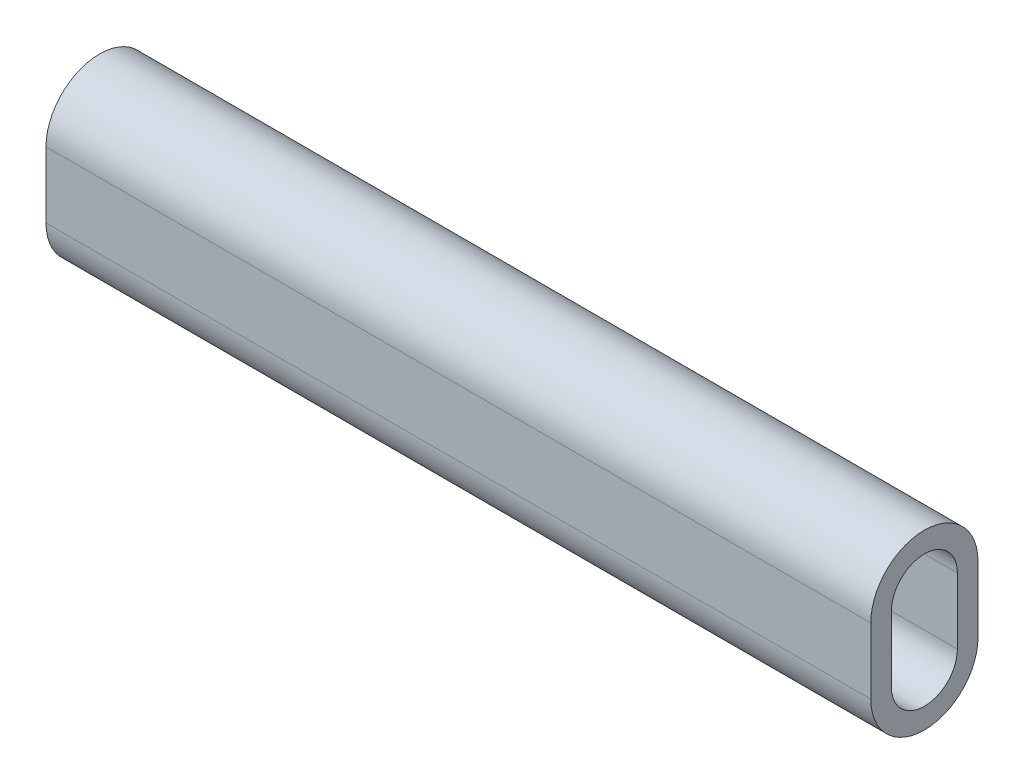
ISO-10303-21;
HEADER;
FILE_DESCRIPTION(('STEP AP214'),'2;1');
FILE_NAME('part.step','',(''),(''),'','','');
FILE_SCHEMA(('AUTOMOTIVE_DESIGN { 1 0 10303 214 1 1 1 1 }'));
ENDSEC;
DATA;
#1=APPLICATION_CONTEXT('core data for automotive mechanical design processes');
#2=APPLICATION_PROTOCOL_DEFINITION('international standard','automotive_design',2000,#1);
#3=PRODUCT_CONTEXT('',#1,'mechanical');
#4=PRODUCT('Part','Part','',(#3));
#5=PRODUCT_RELATED_PRODUCT_CATEGORY('part','',(#4));
#6=PRODUCT_DEFINITION_FORMATION('','',#4);
#7=PRODUCT_DEFINITION_CONTEXT('part definition',#1,'design');
#8=PRODUCT_DEFINITION('design','',#6,#7);
#9=PRODUCT_DEFINITION_SHAPE('','',#8);
#10=(LENGTH_UNIT() NAMED_UNIT(*) SI_UNIT(.MILLI.,.METRE.));
#11=(NAMED_UNIT(*) PLANE_ANGLE_UNIT() SI_UNIT($,.RADIAN.));
#12=(NAMED_UNIT(*) SI_UNIT($,.STERADIAN.) SOLID_ANGLE_UNIT());
#13=UNCERTAINTY_MEASURE_WITH_UNIT(LENGTH_MEASURE(1.E-05),#10,'distance_accuracy_value','');
#14=(GEOMETRIC_REPRESENTATION_CONTEXT(3) GLOBAL_UNCERTAINTY_ASSIGNED_CONTEXT((#13)) GLOBAL_UNIT_ASSIGNED_CONTEXT((#10,
#11,#12)) REPRESENTATION_CONTEXT('',''));
#15=CARTESIAN_POINT('',(0.,0.,0.));
#16=DIRECTION('',(0.,0.,1.));
#17=DIRECTION('',(1.,0.,0.));
#18=AXIS2_PLACEMENT_3D('',#15,#16,#17);
#19=CARTESIAN_POINT('',(20.,-0.799999999999999,0.));
#20=DIRECTION('',(1.,0.,0.));
#21=DIRECTION('',(0.,0.,-1.));
#22=AXIS2_PLACEMENT_3D('',#19,#20,#21);
#23=PLANE('',#22);
#24=CARTESIAN_POINT('',(20.,-0.799999999999999,0.));
#25=DIRECTION('',(1.,0.,0.));
#26=DIRECTION('',(0.,0.,-1.));
#27=AXIS2_PLACEMENT_3D('',#24,#25,#26);
#28=CIRCLE('',#27,1.3);
#29=CARTESIAN_POINT('',(20.,-0.799999999999999,1.3));
#30=VERTEX_POINT('',#29);
#31=CARTESIAN_POINT('',(20.,-0.799999999999999,-1.3));
#32=VERTEX_POINT('',#31);
#33=EDGE_CURVE('E134',#30,#32,#28,.T.);
#34=ORIENTED_EDGE('',*,*,#33,.T.);
#35=DIRECTION('',(0.,1.,0.));
#36=VECTOR('',#35,1.);
#37=CARTESIAN_POINT('',(20.,-0.799999999999999,-1.3));
#38=LINE('',#37,#36);
#39=CARTESIAN_POINT('',(20.,0.800000000000002,-1.3));
#40=VERTEX_POINT('',#39);
#41=EDGE_CURVE('E137',#32,#40,#38,.T.);
#42=ORIENTED_EDGE('',*,*,#41,.T.);
#43=CARTESIAN_POINT('',(20.,0.800000000000002,0.));
#44=DIRECTION('',(1.,0.,0.));
#45=DIRECTION('',(0.,0.,-1.));
#46=AXIS2_PLACEMENT_3D('',#43,#44,#45);
#47=CIRCLE('',#46,1.3);
#48=CARTESIAN_POINT('',(20.,0.800000000000002,1.3));
#49=VERTEX_POINT('',#48);
#50=EDGE_CURVE('E140',#40,#49,#47,.T.);
#51=ORIENTED_EDGE('',*,*,#50,.T.);
#52=DIRECTION('',(0.,-1.,0.));
#53=VECTOR('',#52,1.);
#54=CARTESIAN_POINT('',(20.,-0.799999999999999,1.3));
#55=LINE('',#54,#53);
#56=EDGE_CURVE('E142',#49,#30,#55,.T.);
#57=ORIENTED_EDGE('',*,*,#56,.T.);
#58=EDGE_LOOP('',(#34,#42,#51,#57));
#59=FACE_BOUND('',#58,.T.);
#60=DIRECTION('',(0.,1.,0.));
#61=VECTOR('',#60,1.);
#62=CARTESIAN_POINT('',(20.,-0.799999999999999,-0.799999999999999));
#63=LINE('',#62,#61);
#64=CARTESIAN_POINT('',(20.,-0.799999999999999,-0.799999999999999));
#65=VERTEX_POINT('',#64);
#66=CARTESIAN_POINT('',(20.,0.800000000000002,-0.799999999999999));
#67=VERTEX_POINT('',#66);
#68=EDGE_CURVE('E106',#65,#67,#63,.T.);
#69=ORIENTED_EDGE('',*,*,#68,.F.);
#70=CARTESIAN_POINT('',(20.,-0.799999999999999,0.));
#71=DIRECTION('',(1.,0.,0.));
#72=DIRECTION('',(0.,0.,-1.));
#73=AXIS2_PLACEMENT_3D('',#70,#71,#72);
#74=CIRCLE('',#73,0.799999999999999);
#75=CARTESIAN_POINT('',(20.,-0.799999999999999,0.799999999999999));
#76=VERTEX_POINT('',#75);
#77=EDGE_CURVE('E98',#76,#65,#74,.T.);
#78=ORIENTED_EDGE('',*,*,#77,.F.);
#79=DIRECTION('',(0.,-1.,0.));
#80=VECTOR('',#79,1.);
#81=CARTESIAN_POINT('',(20.,-0.799999999999999,0.799999999999999));
#82=LINE('',#81,#80);
#83=CARTESIAN_POINT('',(20.,0.800000000000002,0.799999999999999));
#84=VERTEX_POINT('',#83);
#85=EDGE_CURVE('E120',#84,#76,#82,.T.);
#86=ORIENTED_EDGE('',*,*,#85,.F.);
#87=CARTESIAN_POINT('',(20.,0.800000000000002,0.));
#88=DIRECTION('',(1.,0.,0.));
#89=DIRECTION('',(0.,0.,-1.));
#90=AXIS2_PLACEMENT_3D('',#87,#88,#89);
#91=CIRCLE('',#90,0.799999999999999);
#92=EDGE_CURVE('E118',#67,#84,#91,.T.);
#93=ORIENTED_EDGE('',*,*,#92,.F.);
#94=EDGE_LOOP('',(#69,#78,#86,#93));
#95=FACE_BOUND('',#94,.T.);
#96=ADVANCED_FACE('F33',(#59,#95),#23,.T.);
#97=CARTESIAN_POINT('',(0.,-0.799999999999999,0.));
#98=DIRECTION('',(1.,0.,0.));
#99=DIRECTION('',(0.,0.,-1.));
#100=AXIS2_PLACEMENT_3D('',#97,#98,#99);
#101=PLANE('',#100);
#102=CARTESIAN_POINT('',(0.,-0.799999999999999,0.));
#103=DIRECTION('',(1.,0.,0.));
#104=DIRECTION('',(0.,0.,-1.));
#105=AXIS2_PLACEMENT_3D('',#102,#103,#104);
#106=CIRCLE('',#105,1.3);
#107=CARTESIAN_POINT('',(0.,-0.799999999999999,1.3));
#108=VERTEX_POINT('',#107);
#109=CARTESIAN_POINT('',(0.,-0.799999999999999,-1.3));
#110=VERTEX_POINT('',#109);
#111=EDGE_CURVE('E114',#108,#110,#106,.T.);
#112=ORIENTED_EDGE('',*,*,#111,.F.);
#113=DIRECTION('',(0.,-1.,0.));
#114=VECTOR('',#113,1.);
#115=CARTESIAN_POINT('',(0.,-0.799999999999999,1.3));
#116=LINE('',#115,#114);
#117=CARTESIAN_POINT('',(0.,0.800000000000002,1.3));
#118=VERTEX_POINT('',#117);
#119=EDGE_CURVE('E138',#118,#108,#116,.T.);
#120=ORIENTED_EDGE('',*,*,#119,.F.);
#121=CARTESIAN_POINT('',(0.,0.800000000000002,0.));
#122=DIRECTION('',(1.,0.,0.));
#123=DIRECTION('',(0.,0.,-1.));
#124=AXIS2_PLACEMENT_3D('',#121,#122,#123);
#125=CIRCLE('',#124,1.3);
#126=CARTESIAN_POINT('',(0.,0.800000000000002,-1.3));
#127=VERTEX_POINT('',#126);
#128=EDGE_CURVE('E149',#127,#118,#125,.T.);
#129=ORIENTED_EDGE('',*,*,#128,.F.);
#130=DIRECTION('',(0.,1.,0.));
#131=VECTOR('',#130,1.);
#132=CARTESIAN_POINT('',(0.,-0.799999999999999,-1.3));
#133=LINE('',#132,#131);
#134=EDGE_CURVE('E147',#110,#127,#133,.T.);
#135=ORIENTED_EDGE('',*,*,#134,.F.);
#136=EDGE_LOOP('',(#112,#120,#129,#135));
#137=FACE_BOUND('',#136,.T.);
#138=CARTESIAN_POINT('',(0.,-0.799999999999999,0.));
#139=DIRECTION('',(1.,0.,0.));
#140=DIRECTION('',(0.,0.,-1.));
#141=AXIS2_PLACEMENT_3D('',#138,#139,#140);
#142=CIRCLE('',#141,0.799999999999999);
#143=CARTESIAN_POINT('',(0.,-0.799999999999999,0.799999999999999));
#144=VERTEX_POINT('',#143);
#145=CARTESIAN_POINT('',(0.,-0.799999999999999,-0.799999999999999));
#146=VERTEX_POINT('',#145);
#147=EDGE_CURVE('E56',#144,#146,#142,.T.);
#148=ORIENTED_EDGE('',*,*,#147,.T.);
#149=DIRECTION('',(0.,1.,0.));
#150=VECTOR('',#149,1.);
#151=CARTESIAN_POINT('',(0.,-0.799999999999999,-0.799999999999999));
#152=LINE('',#151,#150);
#153=CARTESIAN_POINT('',(0.,0.800000000000002,-0.799999999999999));
#154=VERTEX_POINT('',#153);
#155=EDGE_CURVE('E113',#146,#154,#152,.T.);
#156=ORIENTED_EDGE('',*,*,#155,.T.);
#157=CARTESIAN_POINT('',(0.,0.800000000000002,0.));
#158=DIRECTION('',(1.,0.,0.));
#159=DIRECTION('',(0.,0.,-1.));
#160=AXIS2_PLACEMENT_3D('',#157,#158,#159);
#161=CIRCLE('',#160,0.799999999999999);
#162=CARTESIAN_POINT('',(0.,0.800000000000002,0.799999999999999));
#163=VERTEX_POINT('',#162);
#164=EDGE_CURVE('E126',#154,#163,#161,.T.);
#165=ORIENTED_EDGE('',*,*,#164,.T.);
#166=DIRECTION('',(0.,-1.,0.));
#167=VECTOR('',#166,1.);
#168=CARTESIAN_POINT('',(0.,-0.799999999999999,0.799999999999999));
#169=LINE('',#168,#167);
#170=EDGE_CURVE('E107',#163,#144,#169,.T.);
#171=ORIENTED_EDGE('',*,*,#170,.T.);
#172=EDGE_LOOP('',(#148,#156,#165,#171));
#173=FACE_BOUND('',#172,.T.);
#174=ADVANCED_FACE('F167',(#137,#173),#101,.F.);
#175=CARTESIAN_POINT('',(20.,-0.799999999999999,0.));
#176=DIRECTION('',(-1.,0.,0.));
#177=DIRECTION('',(0.,0.,1.));
#178=AXIS2_PLACEMENT_3D('',#175,#176,#177);
#179=CYLINDRICAL_SURFACE('',#178,1.3);
#180=ORIENTED_EDGE('',*,*,#111,.T.);
#181=DIRECTION('',(-1.,0.,0.));
#182=VECTOR('',#181,1.);
#183=CARTESIAN_POINT('',(20.,-0.799999999999999,-1.3));
#184=LINE('',#183,#182);
#185=EDGE_CURVE('E11',#32,#110,#184,.T.);
#186=ORIENTED_EDGE('',*,*,#185,.F.);
#187=ORIENTED_EDGE('',*,*,#33,.F.);
#188=DIRECTION('',(-1.,0.,0.));
#189=VECTOR('',#188,1.);
#190=CARTESIAN_POINT('',(20.,-0.799999999999999,1.3));
#191=LINE('',#190,#189);
#192=EDGE_CURVE('E144',#30,#108,#191,.T.);
#193=ORIENTED_EDGE('',*,*,#192,.T.);
#194=EDGE_LOOP('',(#180,#186,#187,#193));
#195=FACE_BOUND('',#194,.T.);
#196=ADVANCED_FACE('F35',(#195),#179,.T.);
#197=CARTESIAN_POINT('',(20.,-0.799999999999999,-1.3));
#198=DIRECTION('',(0.,0.,1.));
#199=DIRECTION('',(0.,-1.,0.));
#200=AXIS2_PLACEMENT_3D('',#197,#198,#199);
#201=PLANE('',#200);
#202=ORIENTED_EDGE('',*,*,#134,.T.);
#203=DIRECTION('',(-1.,0.,0.));
#204=VECTOR('',#203,1.);
#205=CARTESIAN_POINT('',(20.,0.800000000000002,-1.3));
#206=LINE('',#205,#204);
#207=EDGE_CURVE('E41',#40,#127,#206,.T.);
#208=ORIENTED_EDGE('',*,*,#207,.F.);
#209=ORIENTED_EDGE('',*,*,#41,.F.);
#210=ORIENTED_EDGE('',*,*,#185,.T.);
#211=EDGE_LOOP('',(#202,#208,#209,#210));
#212=FACE_BOUND('',#211,.T.);
#213=ADVANCED_FACE('F177',(#212),#201,.F.);
#214=CARTESIAN_POINT('',(20.,0.800000000000002,0.));
#215=DIRECTION('',(-1.,0.,0.));
#216=DIRECTION('',(0.,0.,1.));
#217=AXIS2_PLACEMENT_3D('',#214,#215,#216);
#218=CYLINDRICAL_SURFACE('',#217,1.3);
#219=ORIENTED_EDGE('',*,*,#128,.T.);
#220=DIRECTION('',(-1.,0.,0.));
#221=VECTOR('',#220,1.);
#222=CARTESIAN_POINT('',(20.,0.800000000000002,1.3));
#223=LINE('',#222,#221);
#224=EDGE_CURVE('E154',#49,#118,#223,.T.);
#225=ORIENTED_EDGE('',*,*,#224,.F.);
#226=ORIENTED_EDGE('',*,*,#50,.F.);
#227=ORIENTED_EDGE('',*,*,#207,.T.);
#228=EDGE_LOOP('',(#219,#225,#226,#227));
#229=FACE_BOUND('',#228,.T.);
#230=ADVANCED_FACE('F161',(#229),#218,.T.);
#231=CARTESIAN_POINT('',(20.,-0.799999999999999,1.3));
#232=DIRECTION('',(0.,0.,-1.));
#233=DIRECTION('',(-1.,0.,0.));
#234=AXIS2_PLACEMENT_3D('',#231,#232,#233);
#235=PLANE('',#234);
#236=ORIENTED_EDGE('',*,*,#119,.T.);
#237=ORIENTED_EDGE('',*,*,#192,.F.);
#238=ORIENTED_EDGE('',*,*,#56,.F.);
#239=ORIENTED_EDGE('',*,*,#224,.T.);
#240=EDGE_LOOP('',(#236,#237,#238,#239));
#241=FACE_BOUND('',#240,.T.);
#242=ADVANCED_FACE('F171',(#241),#235,.F.);
#243=CARTESIAN_POINT('',(20.,-0.799999999999999,0.));
#244=DIRECTION('',(-1.,0.,0.));
#245=DIRECTION('',(0.,0.,1.));
#246=AXIS2_PLACEMENT_3D('',#243,#244,#245);
#247=CYLINDRICAL_SURFACE('',#246,0.799999999999999);
#248=ORIENTED_EDGE('',*,*,#147,.F.);
#249=DIRECTION('',(-1.,0.,0.));
#250=VECTOR('',#249,1.);
#251=CARTESIAN_POINT('',(20.,-0.799999999999999,0.799999999999999));
#252=LINE('',#251,#250);
#253=EDGE_CURVE('E102',#76,#144,#252,.T.);
#254=ORIENTED_EDGE('',*,*,#253,.F.);
#255=ORIENTED_EDGE('',*,*,#77,.T.);
#256=DIRECTION('',(-1.,0.,0.));
#257=VECTOR('',#256,1.);
#258=CARTESIAN_POINT('',(20.,-0.799999999999999,-0.799999999999999));
#259=LINE('',#258,#257);
#260=EDGE_CURVE('E101',#65,#146,#259,.T.);
#261=ORIENTED_EDGE('',*,*,#260,.T.);
#262=EDGE_LOOP('',(#248,#254,#255,#261));
#263=FACE_BOUND('',#262,.T.);
#264=ADVANCED_FACE('F100',(#263),#247,.F.);
#265=CARTESIAN_POINT('',(20.,-0.799999999999999,-0.799999999999999));
#266=DIRECTION('',(0.,0.,1.));
#267=DIRECTION('',(1.,0.,0.));
#268=AXIS2_PLACEMENT_3D('',#265,#266,#267);
#269=PLANE('',#268);
#270=ORIENTED_EDGE('',*,*,#155,.F.);
#271=ORIENTED_EDGE('',*,*,#260,.F.);
#272=ORIENTED_EDGE('',*,*,#68,.T.);
#273=DIRECTION('',(-1.,0.,0.));
#274=VECTOR('',#273,1.);
#275=CARTESIAN_POINT('',(20.,0.800000000000002,-0.799999999999999));
#276=LINE('',#275,#274);
#277=EDGE_CURVE('E115',#67,#154,#276,.T.);
#278=ORIENTED_EDGE('',*,*,#277,.T.);
#279=EDGE_LOOP('',(#270,#271,#272,#278));
#280=FACE_BOUND('',#279,.T.);
#281=ADVANCED_FACE('F110',(#280),#269,.T.);
#282=CARTESIAN_POINT('',(20.,0.800000000000002,0.));
#283=DIRECTION('',(-1.,0.,0.));
#284=DIRECTION('',(0.,0.,1.));
#285=AXIS2_PLACEMENT_3D('',#282,#283,#284);
#286=CYLINDRICAL_SURFACE('',#285,0.799999999999999);
#287=ORIENTED_EDGE('',*,*,#164,.F.);
#288=ORIENTED_EDGE('',*,*,#277,.F.);
#289=ORIENTED_EDGE('',*,*,#92,.T.);
#290=DIRECTION('',(-1.,0.,0.));
#291=VECTOR('',#290,1.);
#292=CARTESIAN_POINT('',(20.,0.800000000000002,0.799999999999999));
#293=LINE('',#292,#291);
#294=EDGE_CURVE('E48',#84,#163,#293,.T.);
#295=ORIENTED_EDGE('',*,*,#294,.T.);
#296=EDGE_LOOP('',(#287,#288,#289,#295));
#297=FACE_BOUND('',#296,.T.);
#298=ADVANCED_FACE('F200',(#297),#286,.F.);
#299=CARTESIAN_POINT('',(20.,-0.799999999999999,0.799999999999999));
#300=DIRECTION('',(0.,0.,-1.));
#301=DIRECTION('',(-1.,0.,0.));
#302=AXIS2_PLACEMENT_3D('',#299,#300,#301);
#303=PLANE('',#302);
#304=ORIENTED_EDGE('',*,*,#170,.F.);
#305=ORIENTED_EDGE('',*,*,#294,.F.);
#306=ORIENTED_EDGE('',*,*,#85,.T.);
#307=ORIENTED_EDGE('',*,*,#253,.T.);
#308=EDGE_LOOP('',(#304,#305,#306,#307));
#309=FACE_BOUND('',#308,.T.);
#310=ADVANCED_FACE('F204',(#309),#303,.T.);
#311=CLOSED_SHELL('',(#96,#174,#196,#213,#230,#242,#264,#281,#298,#310));
#312=MANIFOLD_SOLID_BREP('B2',#311);
#313=ADVANCED_BREP_SHAPE_REPRESENTATION('',(#18,#312),#14);
#314=SHAPE_DEFINITION_REPRESENTATION(#9,#313);
ENDSEC;
END-ISO-10303-21;
